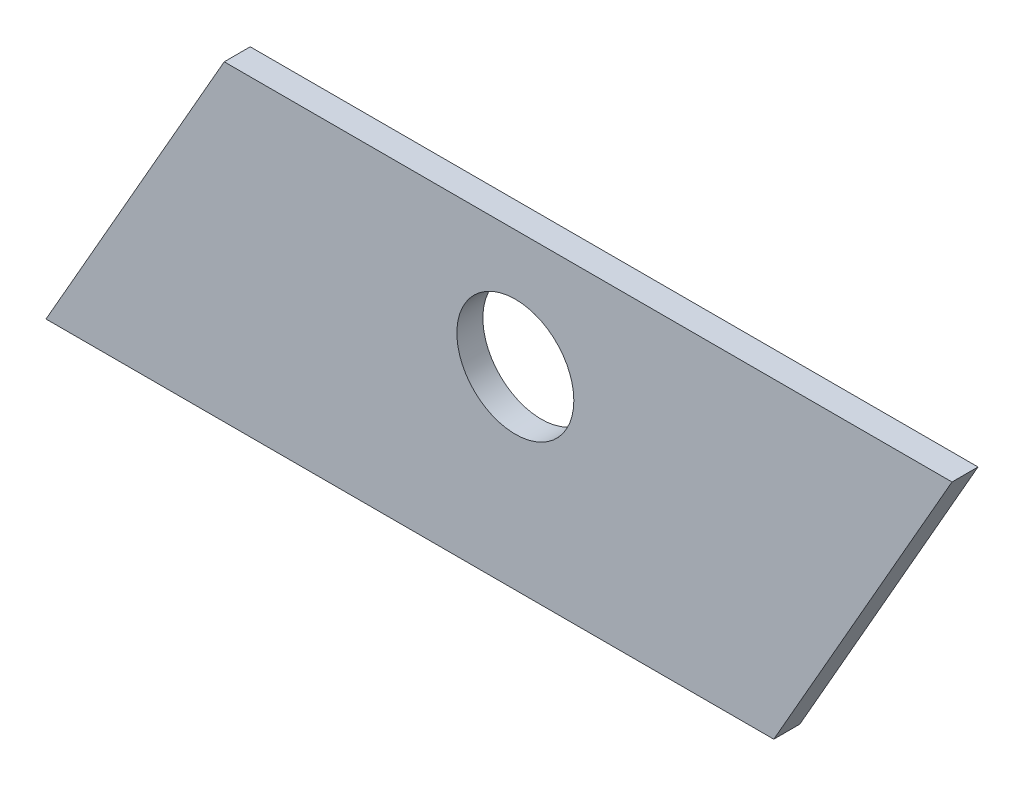
ISO-10303-21;
HEADER;
FILE_DESCRIPTION(('STEP AP214'),'2;1');
FILE_NAME('part.step','',(''),(''),'','','');
FILE_SCHEMA(('AUTOMOTIVE_DESIGN { 1 0 10303 214 1 1 1 1 }'));
ENDSEC;
DATA;
#1=APPLICATION_CONTEXT('core data for automotive mechanical design processes');
#2=APPLICATION_PROTOCOL_DEFINITION('international standard','automotive_design',2000,#1);
#3=PRODUCT_CONTEXT('',#1,'mechanical');
#4=PRODUCT('Part','Part','',(#3));
#5=PRODUCT_RELATED_PRODUCT_CATEGORY('part','',(#4));
#6=PRODUCT_DEFINITION_FORMATION('','',#4);
#7=PRODUCT_DEFINITION_CONTEXT('part definition',#1,'design');
#8=PRODUCT_DEFINITION('design','',#6,#7);
#9=PRODUCT_DEFINITION_SHAPE('','',#8);
#10=(LENGTH_UNIT() NAMED_UNIT(*) SI_UNIT(.MILLI.,.METRE.));
#11=(NAMED_UNIT(*) PLANE_ANGLE_UNIT() SI_UNIT($,.RADIAN.));
#12=(NAMED_UNIT(*) SI_UNIT($,.STERADIAN.) SOLID_ANGLE_UNIT());
#13=UNCERTAINTY_MEASURE_WITH_UNIT(LENGTH_MEASURE(1.E-05),#10,'distance_accuracy_value','');
#14=(GEOMETRIC_REPRESENTATION_CONTEXT(3) GLOBAL_UNCERTAINTY_ASSIGNED_CONTEXT((#13)) GLOBAL_UNIT_ASSIGNED_CONTEXT((#10,
#11,#12)) REPRESENTATION_CONTEXT('',''));
#15=CARTESIAN_POINT('',(0.,0.,0.));
#16=DIRECTION('',(0.,0.,1.));
#17=DIRECTION('',(1.,0.,0.));
#18=AXIS2_PLACEMENT_3D('',#15,#16,#17);
#19=CARTESIAN_POINT('',(-45.3571428571428,33.1107142857143,3.175));
#20=DIRECTION('',(0.868243142124459,-0.496138938356834,0.));
#21=DIRECTION('',(0.496138938356834,0.868243142124459,0.));
#22=AXIS2_PLACEMENT_3D('',#19,#20,#21);
#23=PLANE('',#22);
#24=DIRECTION('',(-0.496138938356834,-0.868243142124459,0.));
#25=VECTOR('',#24,1.);
#26=CARTESIAN_POINT('',(-45.3571428571428,33.1107142857143,-3.175));
#27=LINE('',#26,#25);
#28=CARTESIAN_POINT('',(-45.3571428571428,33.1107142857143,-3.175));
#29=VERTEX_POINT('',#28);
#30=CARTESIAN_POINT('',(-88.9,-43.0892857142857,-3.175));
#31=VERTEX_POINT('',#30);
#32=EDGE_CURVE('E96',#29,#31,#27,.T.);
#33=ORIENTED_EDGE('',*,*,#32,.T.);
#34=DIRECTION('',(0.,0.,-1.));
#35=VECTOR('',#34,1.);
#36=CARTESIAN_POINT('',(-88.9,-43.0892857142857,3.175));
#37=LINE('',#36,#35);
#38=CARTESIAN_POINT('',(-88.9,-43.0892857142857,3.175));
#39=VERTEX_POINT('',#38);
#40=EDGE_CURVE('E11',#39,#31,#37,.T.);
#41=ORIENTED_EDGE('',*,*,#40,.F.);
#42=DIRECTION('',(-0.496138938356834,-0.868243142124459,0.));
#43=VECTOR('',#42,1.);
#44=CARTESIAN_POINT('',(-45.3571428571428,33.1107142857143,3.175));
#45=LINE('',#44,#43);
#46=CARTESIAN_POINT('',(-45.3571428571428,33.1107142857143,3.175));
#47=VERTEX_POINT('',#46);
#48=EDGE_CURVE('E84',#47,#39,#45,.T.);
#49=ORIENTED_EDGE('',*,*,#48,.F.);
#50=DIRECTION('',(0.,0.,-1.));
#51=VECTOR('',#50,1.);
#52=CARTESIAN_POINT('',(-45.3571428571428,33.1107142857143,3.175));
#53=LINE('',#52,#51);
#54=EDGE_CURVE('E92',#47,#29,#53,.T.);
#55=ORIENTED_EDGE('',*,*,#54,.T.);
#56=EDGE_LOOP('',(#33,#41,#49,#55));
#57=FACE_BOUND('',#56,.T.);
#58=ADVANCED_FACE('F33',(#57),#23,.F.);
#59=CARTESIAN_POINT('',(-88.9,-43.0892857142857,3.175));
#60=DIRECTION('',(0.,1.,0.));
#61=DIRECTION('',(-1.,0.,0.));
#62=AXIS2_PLACEMENT_3D('',#59,#60,#61);
#63=PLANE('',#62);
#64=DIRECTION('',(1.,0.,0.));
#65=VECTOR('',#64,1.);
#66=CARTESIAN_POINT('',(-88.9,-43.0892857142857,-3.175));
#67=LINE('',#66,#65);
#68=CARTESIAN_POINT('',(88.9,-43.0892857142857,-3.175));
#69=VERTEX_POINT('',#68);
#70=EDGE_CURVE('E88',#31,#69,#67,.T.);
#71=ORIENTED_EDGE('',*,*,#70,.T.);
#72=DIRECTION('',(0.,0.,-1.));
#73=VECTOR('',#72,1.);
#74=CARTESIAN_POINT('',(88.9,-43.0892857142857,3.175));
#75=LINE('',#74,#73);
#76=CARTESIAN_POINT('',(88.9,-43.0892857142857,3.175));
#77=VERTEX_POINT('',#76);
#78=EDGE_CURVE('E41',#77,#69,#75,.T.);
#79=ORIENTED_EDGE('',*,*,#78,.F.);
#80=DIRECTION('',(1.,0.,0.));
#81=VECTOR('',#80,1.);
#82=CARTESIAN_POINT('',(-88.9,-43.0892857142857,3.175));
#83=LINE('',#82,#81);
#84=EDGE_CURVE('E79',#39,#77,#83,.T.);
#85=ORIENTED_EDGE('',*,*,#84,.F.);
#86=ORIENTED_EDGE('',*,*,#40,.T.);
#87=EDGE_LOOP('',(#71,#79,#85,#86));
#88=FACE_BOUND('',#87,.T.);
#89=ADVANCED_FACE('F87',(#88),#63,.F.);
#90=CARTESIAN_POINT('',(88.9,-43.0892857142857,3.175));
#91=DIRECTION('',(-0.868243142124459,0.496138938356834,0.));
#92=DIRECTION('',(-0.496138938356834,-0.868243142124459,0.));
#93=AXIS2_PLACEMENT_3D('',#90,#91,#92);
#94=PLANE('',#93);
#95=DIRECTION('',(0.496138938356834,0.868243142124459,0.));
#96=VECTOR('',#95,1.);
#97=CARTESIAN_POINT('',(88.9,-43.0892857142857,-3.175));
#98=LINE('',#97,#96);
#99=CARTESIAN_POINT('',(132.442857142857,33.1107142857143,-3.175));
#100=VERTEX_POINT('',#99);
#101=EDGE_CURVE('E66',#69,#100,#98,.T.);
#102=ORIENTED_EDGE('',*,*,#101,.T.);
#103=DIRECTION('',(0.,0.,-1.));
#104=VECTOR('',#103,1.);
#105=CARTESIAN_POINT('',(132.442857142857,33.1107142857143,3.175));
#106=LINE('',#105,#104);
#107=CARTESIAN_POINT('',(132.442857142857,33.1107142857143,3.175));
#108=VERTEX_POINT('',#107);
#109=EDGE_CURVE('E89',#108,#100,#106,.T.);
#110=ORIENTED_EDGE('',*,*,#109,.F.);
#111=DIRECTION('',(0.496138938356834,0.868243142124459,0.));
#112=VECTOR('',#111,1.);
#113=CARTESIAN_POINT('',(88.9,-43.0892857142857,3.175));
#114=LINE('',#113,#112);
#115=EDGE_CURVE('E82',#77,#108,#114,.T.);
#116=ORIENTED_EDGE('',*,*,#115,.F.);
#117=ORIENTED_EDGE('',*,*,#78,.T.);
#118=EDGE_LOOP('',(#102,#110,#116,#117));
#119=FACE_BOUND('',#118,.T.);
#120=ADVANCED_FACE('F90',(#119),#94,.F.);
#121=CARTESIAN_POINT('',(132.442857142857,33.1107142857143,3.175));
#122=DIRECTION('',(0.,-1.,0.));
#123=DIRECTION('',(1.,0.,0.));
#124=AXIS2_PLACEMENT_3D('',#121,#122,#123);
#125=PLANE('',#124);
#126=DIRECTION('',(-1.,0.,0.));
#127=VECTOR('',#126,1.);
#128=CARTESIAN_POINT('',(132.442857142857,33.1107142857143,-3.175));
#129=LINE('',#128,#127);
#130=EDGE_CURVE('E72',#100,#29,#129,.T.);
#131=ORIENTED_EDGE('',*,*,#130,.T.);
#132=ORIENTED_EDGE('',*,*,#54,.F.);
#133=DIRECTION('',(-1.,0.,0.));
#134=VECTOR('',#133,1.);
#135=CARTESIAN_POINT('',(132.442857142857,33.1107142857143,3.175));
#136=LINE('',#135,#134);
#137=EDGE_CURVE('E49',#108,#47,#136,.T.);
#138=ORIENTED_EDGE('',*,*,#137,.F.);
#139=ORIENTED_EDGE('',*,*,#109,.T.);
#140=EDGE_LOOP('',(#131,#132,#138,#139));
#141=FACE_BOUND('',#140,.T.);
#142=ADVANCED_FACE('F104',(#141),#125,.F.);
#143=CARTESIAN_POINT('',(0.,0.,3.175));
#144=DIRECTION('',(0.,0.,1.));
#145=DIRECTION('',(1.,0.,0.));
#146=AXIS2_PLACEMENT_3D('',#143,#144,#145);
#147=PLANE('',#146);
#148=CARTESIAN_POINT('',(25.7628571428572,4.15471428571432,3.175));
#149=DIRECTION('',(0.,0.,1.));
#150=DIRECTION('',(1.,0.,0.));
#151=AXIS2_PLACEMENT_3D('',#148,#149,#150);
#152=CIRCLE('',#151,14.2875);
#153=CARTESIAN_POINT('',(40.0503571428572,4.15471428571432,3.175));
#154=VERTEX_POINT('',#153);
#155=EDGE_CURVE('E110',#154,#154,#152,.T.);
#156=ORIENTED_EDGE('',*,*,#155,.F.);
#157=EDGE_LOOP('',(#156));
#158=FACE_BOUND('',#157,.T.);
#159=ORIENTED_EDGE('',*,*,#48,.T.);
#160=ORIENTED_EDGE('',*,*,#84,.T.);
#161=ORIENTED_EDGE('',*,*,#115,.T.);
#162=ORIENTED_EDGE('',*,*,#137,.T.);
#163=EDGE_LOOP('',(#159,#160,#161,#162));
#164=FACE_BOUND('',#163,.T.);
#165=ADVANCED_FACE('F80',(#158,#164),#147,.T.);
#166=CARTESIAN_POINT('',(0.,0.,-3.175));
#167=DIRECTION('',(0.,0.,1.));
#168=DIRECTION('',(1.,0.,0.));
#169=AXIS2_PLACEMENT_3D('',#166,#167,#168);
#170=PLANE('',#169);
#171=CARTESIAN_POINT('',(25.7628571428572,4.15471428571432,-3.175));
#172=DIRECTION('',(0.,0.,1.));
#173=DIRECTION('',(1.,0.,0.));
#174=AXIS2_PLACEMENT_3D('',#171,#172,#173);
#175=CIRCLE('',#174,14.2875);
#176=CARTESIAN_POINT('',(40.0503571428572,4.15471428571432,-3.175));
#177=VERTEX_POINT('',#176);
#178=EDGE_CURVE('E99',#177,#177,#175,.T.);
#179=ORIENTED_EDGE('',*,*,#178,.T.);
#180=EDGE_LOOP('',(#179));
#181=FACE_BOUND('',#180,.T.);
#182=ORIENTED_EDGE('',*,*,#32,.F.);
#183=ORIENTED_EDGE('',*,*,#130,.F.);
#184=ORIENTED_EDGE('',*,*,#101,.F.);
#185=ORIENTED_EDGE('',*,*,#70,.F.);
#186=EDGE_LOOP('',(#182,#183,#184,#185));
#187=FACE_BOUND('',#186,.T.);
#188=ADVANCED_FACE('F107',(#181,#187),#170,.F.);
#189=CARTESIAN_POINT('',(25.7628571428572,4.15471428571432,-3.175));
#190=DIRECTION('',(0.,0.,1.));
#191=DIRECTION('',(1.,0.,0.));
#192=AXIS2_PLACEMENT_3D('',#189,#190,#191);
#193=CYLINDRICAL_SURFACE('',#192,14.2875);
#194=ORIENTED_EDGE('',*,*,#178,.F.);
#195=EDGE_LOOP('',(#194));
#196=FACE_BOUND('',#195,.T.);
#197=ORIENTED_EDGE('',*,*,#155,.T.);
#198=EDGE_LOOP('',(#197));
#199=FACE_BOUND('',#198,.T.);
#200=ADVANCED_FACE('F117',(#196,#199),#193,.F.);
#201=CLOSED_SHELL('',(#58,#89,#120,#142,#165,#188,#200));
#202=MANIFOLD_SOLID_BREP('B2',#201);
#203=ADVANCED_BREP_SHAPE_REPRESENTATION('',(#18,#202),#14);
#204=SHAPE_DEFINITION_REPRESENTATION(#9,#203);
ENDSEC;
END-ISO-10303-21;
